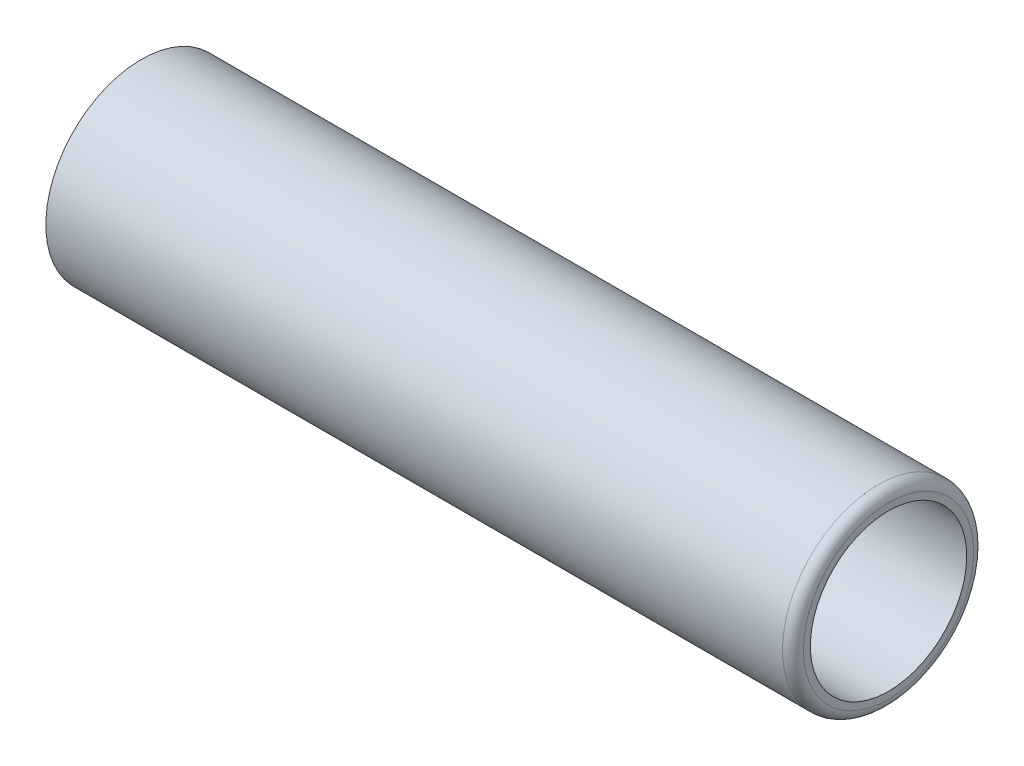
ISO-10303-21;
HEADER;
FILE_DESCRIPTION(('STEP AP214'),'2;1');
FILE_NAME('part.step','',(''),(''),'','','');
FILE_SCHEMA(('AUTOMOTIVE_DESIGN { 1 0 10303 214 1 1 1 1 }'));
ENDSEC;
DATA;
#1=APPLICATION_CONTEXT('core data for automotive mechanical design processes');
#2=APPLICATION_PROTOCOL_DEFINITION('international standard','automotive_design',2000,#1);
#3=PRODUCT_CONTEXT('',#1,'mechanical');
#4=PRODUCT('Part','Part','',(#3));
#5=PRODUCT_RELATED_PRODUCT_CATEGORY('part','',(#4));
#6=PRODUCT_DEFINITION_FORMATION('','',#4);
#7=PRODUCT_DEFINITION_CONTEXT('part definition',#1,'design');
#8=PRODUCT_DEFINITION('design','',#6,#7);
#9=PRODUCT_DEFINITION_SHAPE('','',#8);
#10=(LENGTH_UNIT() NAMED_UNIT(*) SI_UNIT(.MILLI.,.METRE.));
#11=(NAMED_UNIT(*) PLANE_ANGLE_UNIT() SI_UNIT($,.RADIAN.));
#12=(NAMED_UNIT(*) SI_UNIT($,.STERADIAN.) SOLID_ANGLE_UNIT());
#13=UNCERTAINTY_MEASURE_WITH_UNIT(LENGTH_MEASURE(1.E-05),#10,'distance_accuracy_value','');
#14=(GEOMETRIC_REPRESENTATION_CONTEXT(3) GLOBAL_UNCERTAINTY_ASSIGNED_CONTEXT((#13)) GLOBAL_UNIT_ASSIGNED_CONTEXT((#10,
#11,#12)) REPRESENTATION_CONTEXT('',''));
#15=CARTESIAN_POINT('',(0.,0.,0.));
#16=DIRECTION('',(0.,0.,1.));
#17=DIRECTION('',(1.,0.,0.));
#18=AXIS2_PLACEMENT_3D('',#15,#16,#17);
#19=CARTESIAN_POINT('',(54.61,0.,0.));
#20=DIRECTION('',(1.,0.,0.));
#21=DIRECTION('',(0.,0.,-1.));
#22=AXIS2_PLACEMENT_3D('',#19,#20,#21);
#23=PLANE('',#22);
#24=CARTESIAN_POINT('',(54.61,0.,0.));
#25=DIRECTION('',(1.,0.,0.));
#26=DIRECTION('',(0.,0.,-1.));
#27=AXIS2_PLACEMENT_3D('',#24,#25,#26);
#28=CIRCLE('',#27,6.223);
#29=CARTESIAN_POINT('',(54.61,0.,-6.223));
#30=VERTEX_POINT('',#29);
#31=EDGE_CURVE('E45',#30,#30,#28,.T.);
#32=ORIENTED_EDGE('',*,*,#31,.T.);
#33=EDGE_LOOP('',(#32));
#34=FACE_BOUND('',#33,.T.);
#35=CARTESIAN_POINT('',(54.61,0.,0.));
#36=DIRECTION('',(1.,0.,0.));
#37=DIRECTION('',(0.,0.,-1.));
#38=AXIS2_PLACEMENT_3D('',#35,#36,#37);
#39=CIRCLE('',#38,5.715);
#40=CARTESIAN_POINT('',(54.61,0.,-5.715));
#41=VERTEX_POINT('',#40);
#42=EDGE_CURVE('E55',#41,#41,#39,.T.);
#43=ORIENTED_EDGE('',*,*,#42,.F.);
#44=EDGE_LOOP('',(#43));
#45=FACE_BOUND('',#44,.T.);
#46=ADVANCED_FACE('F37',(#34,#45),#23,.T.);
#47=CARTESIAN_POINT('',(0.,0.,0.));
#48=DIRECTION('',(1.,0.,0.));
#49=DIRECTION('',(0.,0.,-1.));
#50=AXIS2_PLACEMENT_3D('',#47,#48,#49);
#51=PLANE('',#50);
#52=CARTESIAN_POINT('',(0.,0.,0.));
#53=DIRECTION('',(1.,0.,0.));
#54=DIRECTION('',(0.,0.,-1.));
#55=AXIS2_PLACEMENT_3D('',#52,#53,#54);
#56=CIRCLE('',#55,6.985);
#57=CARTESIAN_POINT('',(0.,0.,-6.985));
#58=VERTEX_POINT('',#57);
#59=EDGE_CURVE('E50',#58,#58,#56,.T.);
#60=ORIENTED_EDGE('',*,*,#59,.F.);
#61=EDGE_LOOP('',(#60));
#62=FACE_BOUND('',#61,.T.);
#63=CARTESIAN_POINT('',(0.,0.,0.));
#64=DIRECTION('',(1.,0.,0.));
#65=DIRECTION('',(0.,0.,-1.));
#66=AXIS2_PLACEMENT_3D('',#63,#64,#65);
#67=CIRCLE('',#66,5.715);
#68=CARTESIAN_POINT('',(0.,0.,-5.715));
#69=VERTEX_POINT('',#68);
#70=EDGE_CURVE('E58',#69,#69,#67,.T.);
#71=ORIENTED_EDGE('',*,*,#70,.T.);
#72=EDGE_LOOP('',(#71));
#73=FACE_BOUND('',#72,.T.);
#74=ADVANCED_FACE('F70',(#62,#73),#51,.F.);
#75=CARTESIAN_POINT('',(54.61,0.,0.));
#76=DIRECTION('',(-1.,0.,0.));
#77=DIRECTION('',(0.,0.,1.));
#78=AXIS2_PLACEMENT_3D('',#75,#76,#77);
#79=CYLINDRICAL_SURFACE('',#78,6.985);
#80=CARTESIAN_POINT('',(53.848,0.,0.));
#81=DIRECTION('',(1.,0.,0.));
#82=DIRECTION('',(0.,0.,-1.));
#83=AXIS2_PLACEMENT_3D('',#80,#81,#82);
#84=CIRCLE('',#83,6.985);
#85=CARTESIAN_POINT('',(53.848,0.,-6.985));
#86=VERTEX_POINT('',#85);
#87=EDGE_CURVE('E10',#86,#86,#84,.F.);
#88=ORIENTED_EDGE('',*,*,#87,.T.);
#89=EDGE_LOOP('',(#88));
#90=FACE_BOUND('',#89,.T.);
#91=ORIENTED_EDGE('',*,*,#59,.T.);
#92=EDGE_LOOP('',(#91));
#93=FACE_BOUND('',#92,.T.);
#94=ADVANCED_FACE('F75',(#90,#93),#79,.T.);
#95=CARTESIAN_POINT('',(54.61,0.,0.));
#96=DIRECTION('',(-1.,0.,0.));
#97=DIRECTION('',(0.,0.,1.));
#98=AXIS2_PLACEMENT_3D('',#95,#96,#97);
#99=CYLINDRICAL_SURFACE('',#98,5.715);
#100=ORIENTED_EDGE('',*,*,#42,.T.);
#101=EDGE_LOOP('',(#100));
#102=FACE_BOUND('',#101,.T.);
#103=ORIENTED_EDGE('',*,*,#70,.F.);
#104=EDGE_LOOP('',(#103));
#105=FACE_BOUND('',#104,.T.);
#106=ADVANCED_FACE('F66',(#102,#105),#99,.F.);
#107=CARTESIAN_POINT('',(53.848,0.,0.));
#108=DIRECTION('',(1.,0.,0.));
#109=DIRECTION('',(0.,0.,-1.));
#110=AXIS2_PLACEMENT_3D('',#107,#108,#109);
#111=TOROIDAL_SURFACE('',#110,6.223,0.762);
#112=ORIENTED_EDGE('',*,*,#87,.F.);
#113=EDGE_LOOP('',(#112));
#114=FACE_BOUND('',#113,.T.);
#115=ORIENTED_EDGE('',*,*,#31,.F.);
#116=EDGE_LOOP('',(#115));
#117=FACE_BOUND('',#116,.T.);
#118=ADVANCED_FACE('F39',(#114,#117),#111,.T.);
#119=CLOSED_SHELL('',(#46,#74,#94,#106,#118));
#120=MANIFOLD_SOLID_BREP('B2',#119);
#121=ADVANCED_BREP_SHAPE_REPRESENTATION('',(#18,#120),#14);
#122=SHAPE_DEFINITION_REPRESENTATION(#9,#121);
ENDSEC;
END-ISO-10303-21;
